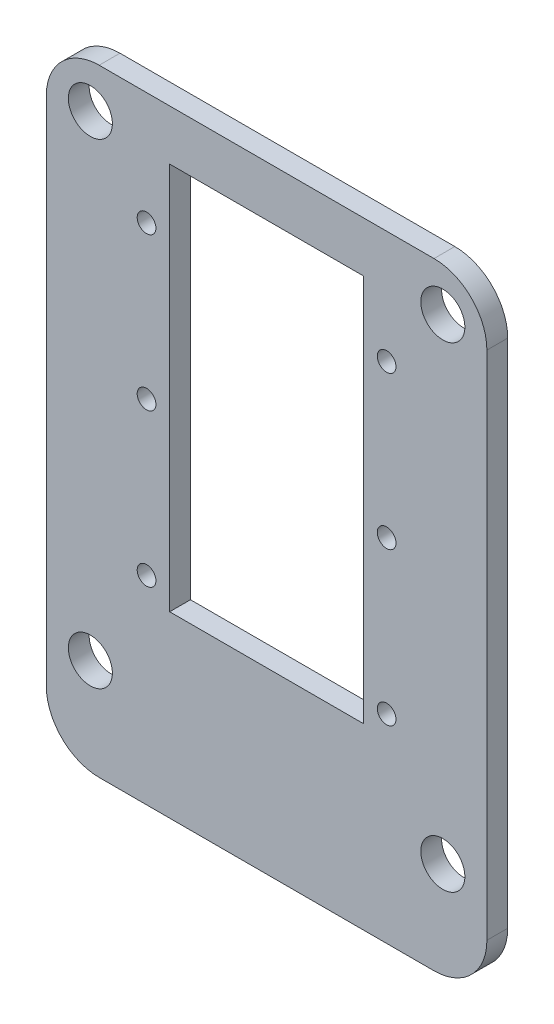
ISO-10303-21;
HEADER;
FILE_DESCRIPTION(('STEP AP214'),'2;1');
FILE_NAME('part.step','',(''),(''),'','','');
FILE_SCHEMA(('AUTOMOTIVE_DESIGN { 1 0 10303 214 1 1 1 1 }'));
ENDSEC;
DATA;
#1=APPLICATION_CONTEXT('core data for automotive mechanical design processes');
#2=APPLICATION_PROTOCOL_DEFINITION('international standard','automotive_design',2000,#1);
#3=PRODUCT_CONTEXT('',#1,'mechanical');
#4=PRODUCT('Part','Part','',(#3));
#5=PRODUCT_RELATED_PRODUCT_CATEGORY('part','',(#4));
#6=PRODUCT_DEFINITION_FORMATION('','',#4);
#7=PRODUCT_DEFINITION_CONTEXT('part definition',#1,'design');
#8=PRODUCT_DEFINITION('design','',#6,#7);
#9=PRODUCT_DEFINITION_SHAPE('','',#8);
#10=(LENGTH_UNIT() NAMED_UNIT(*) SI_UNIT(.MILLI.,.METRE.));
#11=(NAMED_UNIT(*) PLANE_ANGLE_UNIT() SI_UNIT($,.RADIAN.));
#12=(NAMED_UNIT(*) SI_UNIT($,.STERADIAN.) SOLID_ANGLE_UNIT());
#13=UNCERTAINTY_MEASURE_WITH_UNIT(LENGTH_MEASURE(1.E-05),#10,'distance_accuracy_value','');
#14=(GEOMETRIC_REPRESENTATION_CONTEXT(3) GLOBAL_UNCERTAINTY_ASSIGNED_CONTEXT((#13)) GLOBAL_UNIT_ASSIGNED_CONTEXT((#10,
#11,#12)) REPRESENTATION_CONTEXT('',''));
#15=CARTESIAN_POINT('',(0.,0.,0.));
#16=DIRECTION('',(0.,0.,1.));
#17=DIRECTION('',(1.,0.,0.));
#18=AXIS2_PLACEMENT_3D('',#15,#16,#17);
#19=CARTESIAN_POINT('',(-18.1,-22.0973062704397,-3.));
#20=DIRECTION('',(0.,0.,-1.));
#21=DIRECTION('',(-1.,0.,0.));
#22=AXIS2_PLACEMENT_3D('',#19,#20,#21);
#23=PLANE('',#22);
#24=CARTESIAN_POINT('',(25.4,31.8547845003731,-3.));
#25=DIRECTION('',(0.,0.,-1.));
#26=DIRECTION('',(-1.,0.,0.));
#27=AXIS2_PLACEMENT_3D('',#24,#25,#26);
#28=CIRCLE('',#27,3.175);
#29=CARTESIAN_POINT('',(22.225,31.8547845003731,-3.));
#30=VERTEX_POINT('',#29);
#31=EDGE_CURVE('E553',#30,#30,#28,.T.);
#32=ORIENTED_EDGE('',*,*,#31,.F.);
#33=EDGE_LOOP('',(#32));
#34=FACE_BOUND('',#33,.T.);
#35=CARTESIAN_POINT('',(25.3999999999993,-36.7252154996269,-3.));
#36=DIRECTION('',(0.,0.,-1.));
#37=DIRECTION('',(-1.,0.,0.));
#38=AXIS2_PLACEMENT_3D('',#35,#36,#37);
#39=CIRCLE('',#38,3.175);
#40=CARTESIAN_POINT('',(22.2249999999993,-36.7252154996269,-3.));
#41=VERTEX_POINT('',#40);
#42=EDGE_CURVE('E562',#41,#41,#39,.T.);
#43=ORIENTED_EDGE('',*,*,#42,.F.);
#44=EDGE_LOOP('',(#43));
#45=FACE_BOUND('',#44,.T.);
#46=CARTESIAN_POINT('',(-25.4000000000007,-36.7252154996265,-3.));
#47=DIRECTION('',(0.,0.,-1.));
#48=DIRECTION('',(-1.,0.,0.));
#49=AXIS2_PLACEMENT_3D('',#46,#47,#48);
#50=CIRCLE('',#49,3.175);
#51=CARTESIAN_POINT('',(-28.5750000000007,-36.7252154996265,-3.));
#52=VERTEX_POINT('',#51);
#53=EDGE_CURVE('E568',#52,#52,#50,.T.);
#54=ORIENTED_EDGE('',*,*,#53,.F.);
#55=EDGE_LOOP('',(#54));
#56=FACE_BOUND('',#55,.T.);
#57=CARTESIAN_POINT('',(-25.4,31.8547845003735,-3.));
#58=DIRECTION('',(0.,0.,-1.));
#59=DIRECTION('',(-1.,0.,0.));
#60=AXIS2_PLACEMENT_3D('',#57,#58,#59);
#61=CIRCLE('',#60,3.175);
#62=CARTESIAN_POINT('',(-28.575,31.8547845003735,-3.));
#63=VERTEX_POINT('',#62);
#64=EDGE_CURVE('E153',#63,#63,#61,.T.);
#65=ORIENTED_EDGE('',*,*,#64,.F.);
#66=EDGE_LOOP('',(#65));
#67=FACE_BOUND('',#66,.T.);
#68=DIRECTION('',(0.,1.,0.));
#69=VECTOR('',#68,1.);
#70=CARTESIAN_POINT('',(13.97,30.9487845003735,-3.));
#71=LINE('',#70,#69);
#72=CARTESIAN_POINT('',(13.97,-24.9312154996265,-3.));
#73=VERTEX_POINT('',#72);
#74=CARTESIAN_POINT('',(13.97,30.9487845003735,-3.));
#75=VERTEX_POINT('',#74);
#76=EDGE_CURVE('E127',#73,#75,#71,.T.);
#77=ORIENTED_EDGE('',*,*,#76,.T.);
#78=DIRECTION('',(-1.,0.,0.));
#79=VECTOR('',#78,1.);
#80=CARTESIAN_POINT('',(-13.97,30.9487845003735,-3.));
#81=LINE('',#80,#79);
#82=CARTESIAN_POINT('',(-13.97,30.9487845003735,-3.));
#83=VERTEX_POINT('',#82);
#84=EDGE_CURVE('E139',#75,#83,#81,.T.);
#85=ORIENTED_EDGE('',*,*,#84,.T.);
#86=DIRECTION('',(0.,-1.,0.));
#87=VECTOR('',#86,1.);
#88=CARTESIAN_POINT('',(-13.97,30.9487845003735,-3.));
#89=LINE('',#88,#87);
#90=CARTESIAN_POINT('',(-13.97,-24.9312154996265,-3.));
#91=VERTEX_POINT('',#90);
#92=EDGE_CURVE('E143',#83,#91,#89,.T.);
#93=ORIENTED_EDGE('',*,*,#92,.T.);
#94=DIRECTION('',(1.,0.,0.));
#95=VECTOR('',#94,1.);
#96=CARTESIAN_POINT('',(-13.97,-24.9312154996265,-3.));
#97=LINE('',#96,#95);
#98=EDGE_CURVE('E135',#91,#73,#97,.T.);
#99=ORIENTED_EDGE('',*,*,#98,.T.);
#100=EDGE_LOOP('',(#77,#85,#93,#99));
#101=FACE_BOUND('',#100,.T.);
#102=CARTESIAN_POINT('',(-17.3,21.9487845003735,-3.));
#103=DIRECTION('',(0.,0.,-1.));
#104=DIRECTION('',(-1.,0.,0.));
#105=AXIS2_PLACEMENT_3D('',#102,#103,#104);
#106=CIRCLE('',#105,1.35);
#107=CARTESIAN_POINT('',(-18.65,21.9487845003735,-3.));
#108=VERTEX_POINT('',#107);
#109=EDGE_CURVE('E220',#108,#108,#106,.T.);
#110=ORIENTED_EDGE('',*,*,#109,.F.);
#111=EDGE_LOOP('',(#110));
#112=FACE_BOUND('',#111,.T.);
#113=CARTESIAN_POINT('',(-17.3,-0.0512154996265349,-3.));
#114=DIRECTION('',(0.,0.,-1.));
#115=DIRECTION('',(-1.,0.,0.));
#116=AXIS2_PLACEMENT_3D('',#113,#114,#115);
#117=CIRCLE('',#116,1.35);
#118=CARTESIAN_POINT('',(-18.65,-0.0512154996265349,-3.));
#119=VERTEX_POINT('',#118);
#120=EDGE_CURVE('E214',#119,#119,#117,.T.);
#121=ORIENTED_EDGE('',*,*,#120,.F.);
#122=EDGE_LOOP('',(#121));
#123=FACE_BOUND('',#122,.T.);
#124=CARTESIAN_POINT('',(-17.3,-22.0512154996265,-3.));
#125=DIRECTION('',(0.,0.,-1.));
#126=DIRECTION('',(-1.,0.,0.));
#127=AXIS2_PLACEMENT_3D('',#124,#125,#126);
#128=CIRCLE('',#127,1.35);
#129=CARTESIAN_POINT('',(-18.65,-22.0512154996265,-3.));
#130=VERTEX_POINT('',#129);
#131=EDGE_CURVE('E208',#130,#130,#128,.T.);
#132=ORIENTED_EDGE('',*,*,#131,.F.);
#133=EDGE_LOOP('',(#132));
#134=FACE_BOUND('',#133,.T.);
#135=CARTESIAN_POINT('',(17.3,-22.0512154996265,-3.));
#136=DIRECTION('',(0.,0.,-1.));
#137=DIRECTION('',(1.,0.,0.));
#138=AXIS2_PLACEMENT_3D('',#135,#136,#137);
#139=CIRCLE('',#138,1.35);
#140=CARTESIAN_POINT('',(18.65,-22.0512154996265,-3.));
#141=VERTEX_POINT('',#140);
#142=EDGE_CURVE('E202',#141,#141,#139,.T.);
#143=ORIENTED_EDGE('',*,*,#142,.F.);
#144=EDGE_LOOP('',(#143));
#145=FACE_BOUND('',#144,.T.);
#146=CARTESIAN_POINT('',(17.3,-0.0512154996265349,-3.));
#147=DIRECTION('',(0.,0.,-1.));
#148=DIRECTION('',(1.,0.,0.));
#149=AXIS2_PLACEMENT_3D('',#146,#147,#148);
#150=CIRCLE('',#149,1.35);
#151=CARTESIAN_POINT('',(18.65,-0.0512154996265349,-3.));
#152=VERTEX_POINT('',#151);
#153=EDGE_CURVE('E196',#152,#152,#150,.T.);
#154=ORIENTED_EDGE('',*,*,#153,.F.);
#155=EDGE_LOOP('',(#154));
#156=FACE_BOUND('',#155,.T.);
#157=CARTESIAN_POINT('',(17.3,21.9487845003735,-3.));
#158=DIRECTION('',(0.,0.,-1.));
#159=DIRECTION('',(1.,0.,0.));
#160=AXIS2_PLACEMENT_3D('',#157,#158,#159);
#161=CIRCLE('',#160,1.35);
#162=CARTESIAN_POINT('',(18.65,21.9487845003735,-3.));
#163=VERTEX_POINT('',#162);
#164=EDGE_CURVE('E182',#163,#163,#161,.T.);
#165=ORIENTED_EDGE('',*,*,#164,.F.);
#166=EDGE_LOOP('',(#165));
#167=FACE_BOUND('',#166,.T.);
#168=DIRECTION('',(-1.,0.,0.));
#169=VECTOR('',#168,1.);
#170=CARTESIAN_POINT('',(31.75,-50.6952154996265,-3.));
#171=LINE('',#170,#169);
#172=CARTESIAN_POINT('',(24.13,-50.6952154996265,-3.));
#173=VERTEX_POINT('',#172);
#174=CARTESIAN_POINT('',(-24.13,-50.6952154996265,-3.));
#175=VERTEX_POINT('',#174);
#176=EDGE_CURVE('E174',#173,#175,#171,.T.);
#177=ORIENTED_EDGE('',*,*,#176,.T.);
#178=CARTESIAN_POINT('',(-24.13,-43.0752154996265,-3.));
#179=DIRECTION('',(0.,0.,-1.));
#180=DIRECTION('',(-1.,0.,0.));
#181=AXIS2_PLACEMENT_3D('',#178,#179,#180);
#182=CIRCLE('',#181,7.62);
#183=CARTESIAN_POINT('',(-31.75,-43.0752154996265,-3.));
#184=VERTEX_POINT('',#183);
#185=EDGE_CURVE('E239',#175,#184,#182,.T.);
#186=ORIENTED_EDGE('',*,*,#185,.T.);
#187=DIRECTION('',(0.,1.,0.));
#188=VECTOR('',#187,1.);
#189=CARTESIAN_POINT('',(-31.75,38.2047845003735,-3.));
#190=LINE('',#189,#188);
#191=CARTESIAN_POINT('',(-31.75,30.5847845003735,-3.));
#192=VERTEX_POINT('',#191);
#193=EDGE_CURVE('E166',#184,#192,#190,.T.);
#194=ORIENTED_EDGE('',*,*,#193,.T.);
#195=CARTESIAN_POINT('',(-24.13,30.5847845003735,-3.));
#196=DIRECTION('',(0.,0.,-1.));
#197=DIRECTION('',(-1.,0.,0.));
#198=AXIS2_PLACEMENT_3D('',#195,#196,#197);
#199=CIRCLE('',#198,7.62);
#200=CARTESIAN_POINT('',(-24.13,38.2047845003735,-3.));
#201=VERTEX_POINT('',#200);
#202=EDGE_CURVE('E235',#192,#201,#199,.T.);
#203=ORIENTED_EDGE('',*,*,#202,.T.);
#204=DIRECTION('',(1.,0.,0.));
#205=VECTOR('',#204,1.);
#206=CARTESIAN_POINT('',(31.75,38.2047845003735,-3.));
#207=LINE('',#206,#205);
#208=CARTESIAN_POINT('',(24.13,38.2047845003735,-3.));
#209=VERTEX_POINT('',#208);
#210=EDGE_CURVE('E185',#201,#209,#207,.T.);
#211=ORIENTED_EDGE('',*,*,#210,.T.);
#212=CARTESIAN_POINT('',(24.13,30.5847845003735,-3.));
#213=DIRECTION('',(0.,0.,-1.));
#214=DIRECTION('',(-1.,0.,0.));
#215=AXIS2_PLACEMENT_3D('',#212,#213,#214);
#216=CIRCLE('',#215,7.62);
#217=CARTESIAN_POINT('',(31.75,30.5847845003735,-3.));
#218=VERTEX_POINT('',#217);
#219=EDGE_CURVE('E233',#209,#218,#216,.T.);
#220=ORIENTED_EDGE('',*,*,#219,.T.);
#221=DIRECTION('',(0.,-1.,0.));
#222=VECTOR('',#221,1.);
#223=CARTESIAN_POINT('',(31.75,38.2047845003735,-3.));
#224=LINE('',#223,#222);
#225=CARTESIAN_POINT('',(31.75,-43.0752154996265,-3.));
#226=VERTEX_POINT('',#225);
#227=EDGE_CURVE('E188',#218,#226,#224,.T.);
#228=ORIENTED_EDGE('',*,*,#227,.T.);
#229=CARTESIAN_POINT('',(24.13,-43.0752154996265,-3.));
#230=DIRECTION('',(0.,0.,-1.));
#231=DIRECTION('',(-1.,0.,0.));
#232=AXIS2_PLACEMENT_3D('',#229,#230,#231);
#233=CIRCLE('',#232,7.62);
#234=EDGE_CURVE('E237',#226,#173,#233,.T.);
#235=ORIENTED_EDGE('',*,*,#234,.T.);
#236=EDGE_LOOP('',(#177,#186,#194,#203,#211,#220,#228,#235));
#237=FACE_BOUND('',#236,.T.);
#238=ADVANCED_FACE('F34',(#34,#45,#56,#67,#101,#112,#123,#134,#145,#156,#167,#237),#23,.T.);
#239=CARTESIAN_POINT('',(-18.1,-22.0973062704397,0.));
#240=DIRECTION('',(0.,0.,-1.));
#241=DIRECTION('',(-1.,0.,0.));
#242=AXIS2_PLACEMENT_3D('',#239,#240,#241);
#243=PLANE('',#242);
#244=CARTESIAN_POINT('',(25.4,31.8547845003731,0.));
#245=DIRECTION('',(0.,0.,-1.));
#246=DIRECTION('',(-1.,0.,0.));
#247=AXIS2_PLACEMENT_3D('',#244,#245,#246);
#248=CIRCLE('',#247,3.175);
#249=CARTESIAN_POINT('',(22.225,31.8547845003731,0.));
#250=VERTEX_POINT('',#249);
#251=EDGE_CURVE('E551',#250,#250,#248,.T.);
#252=ORIENTED_EDGE('',*,*,#251,.T.);
#253=EDGE_LOOP('',(#252));
#254=FACE_BOUND('',#253,.T.);
#255=CARTESIAN_POINT('',(25.3999999999993,-36.7252154996269,0.));
#256=DIRECTION('',(0.,0.,-1.));
#257=DIRECTION('',(-1.,0.,0.));
#258=AXIS2_PLACEMENT_3D('',#255,#256,#257);
#259=CIRCLE('',#258,3.175);
#260=CARTESIAN_POINT('',(22.2249999999993,-36.7252154996269,0.));
#261=VERTEX_POINT('',#260);
#262=EDGE_CURVE('E557',#261,#261,#259,.T.);
#263=ORIENTED_EDGE('',*,*,#262,.T.);
#264=EDGE_LOOP('',(#263));
#265=FACE_BOUND('',#264,.T.);
#266=CARTESIAN_POINT('',(-25.4000000000007,-36.7252154996265,0.));
#267=DIRECTION('',(0.,0.,-1.));
#268=DIRECTION('',(-1.,0.,0.));
#269=AXIS2_PLACEMENT_3D('',#266,#267,#268);
#270=CIRCLE('',#269,3.175);
#271=CARTESIAN_POINT('',(-28.5750000000007,-36.7252154996265,0.));
#272=VERTEX_POINT('',#271);
#273=EDGE_CURVE('E565',#272,#272,#270,.T.);
#274=ORIENTED_EDGE('',*,*,#273,.T.);
#275=EDGE_LOOP('',(#274));
#276=FACE_BOUND('',#275,.T.);
#277=CARTESIAN_POINT('',(-25.4,31.8547845003735,0.));
#278=DIRECTION('',(0.,0.,-1.));
#279=DIRECTION('',(-1.,0.,0.));
#280=AXIS2_PLACEMENT_3D('',#277,#278,#279);
#281=CIRCLE('',#280,3.175);
#282=CARTESIAN_POINT('',(-28.575,31.8547845003735,0.));
#283=VERTEX_POINT('',#282);
#284=EDGE_CURVE('E160',#283,#283,#281,.T.);
#285=ORIENTED_EDGE('',*,*,#284,.T.);
#286=EDGE_LOOP('',(#285));
#287=FACE_BOUND('',#286,.T.);
#288=DIRECTION('',(-1.,0.,0.));
#289=VECTOR('',#288,1.);
#290=CARTESIAN_POINT('',(-13.97,30.9487845003735,0.));
#291=LINE('',#290,#289);
#292=CARTESIAN_POINT('',(13.97,30.9487845003735,0.));
#293=VERTEX_POINT('',#292);
#294=CARTESIAN_POINT('',(-13.97,30.9487845003735,0.));
#295=VERTEX_POINT('',#294);
#296=EDGE_CURVE('E159',#293,#295,#291,.T.);
#297=ORIENTED_EDGE('',*,*,#296,.F.);
#298=DIRECTION('',(0.,1.,0.));
#299=VECTOR('',#298,1.);
#300=CARTESIAN_POINT('',(13.97,30.9487845003735,0.));
#301=LINE('',#300,#299);
#302=CARTESIAN_POINT('',(13.97,-24.9312154996265,0.));
#303=VERTEX_POINT('',#302);
#304=EDGE_CURVE('E130',#303,#293,#301,.T.);
#305=ORIENTED_EDGE('',*,*,#304,.F.);
#306=DIRECTION('',(1.,0.,0.));
#307=VECTOR('',#306,1.);
#308=CARTESIAN_POINT('',(-13.97,-24.9312154996265,0.));
#309=LINE('',#308,#307);
#310=CARTESIAN_POINT('',(-13.97,-24.9312154996265,0.));
#311=VERTEX_POINT('',#310);
#312=EDGE_CURVE('E147',#311,#303,#309,.T.);
#313=ORIENTED_EDGE('',*,*,#312,.F.);
#314=DIRECTION('',(0.,-1.,0.));
#315=VECTOR('',#314,1.);
#316=CARTESIAN_POINT('',(-13.97,30.9487845003735,0.));
#317=LINE('',#316,#315);
#318=EDGE_CURVE('E150',#295,#311,#317,.T.);
#319=ORIENTED_EDGE('',*,*,#318,.F.);
#320=EDGE_LOOP('',(#297,#305,#313,#319));
#321=FACE_BOUND('',#320,.T.);
#322=CARTESIAN_POINT('',(-17.3,21.9487845003735,0.));
#323=DIRECTION('',(0.,0.,-1.));
#324=DIRECTION('',(-1.,0.,0.));
#325=AXIS2_PLACEMENT_3D('',#322,#323,#324);
#326=CIRCLE('',#325,1.35);
#327=CARTESIAN_POINT('',(-18.65,21.9487845003735,0.));
#328=VERTEX_POINT('',#327);
#329=EDGE_CURVE('E223',#328,#328,#326,.T.);
#330=ORIENTED_EDGE('',*,*,#329,.T.);
#331=EDGE_LOOP('',(#330));
#332=FACE_BOUND('',#331,.T.);
#333=CARTESIAN_POINT('',(-17.3,-0.0512154996265349,0.));
#334=DIRECTION('',(0.,0.,-1.));
#335=DIRECTION('',(-1.,0.,0.));
#336=AXIS2_PLACEMENT_3D('',#333,#334,#335);
#337=CIRCLE('',#336,1.35);
#338=CARTESIAN_POINT('',(-18.65,-0.0512154996265349,0.));
#339=VERTEX_POINT('',#338);
#340=EDGE_CURVE('E217',#339,#339,#337,.T.);
#341=ORIENTED_EDGE('',*,*,#340,.T.);
#342=EDGE_LOOP('',(#341));
#343=FACE_BOUND('',#342,.T.);
#344=CARTESIAN_POINT('',(-17.3,-22.0512154996265,0.));
#345=DIRECTION('',(0.,0.,-1.));
#346=DIRECTION('',(-1.,0.,0.));
#347=AXIS2_PLACEMENT_3D('',#344,#345,#346);
#348=CIRCLE('',#347,1.35);
#349=CARTESIAN_POINT('',(-18.65,-22.0512154996265,0.));
#350=VERTEX_POINT('',#349);
#351=EDGE_CURVE('E211',#350,#350,#348,.T.);
#352=ORIENTED_EDGE('',*,*,#351,.T.);
#353=EDGE_LOOP('',(#352));
#354=FACE_BOUND('',#353,.T.);
#355=CARTESIAN_POINT('',(17.3,-22.0512154996265,0.));
#356=DIRECTION('',(0.,0.,-1.));
#357=DIRECTION('',(1.,0.,0.));
#358=AXIS2_PLACEMENT_3D('',#355,#356,#357);
#359=CIRCLE('',#358,1.35);
#360=CARTESIAN_POINT('',(18.65,-22.0512154996265,0.));
#361=VERTEX_POINT('',#360);
#362=EDGE_CURVE('E205',#361,#361,#359,.T.);
#363=ORIENTED_EDGE('',*,*,#362,.T.);
#364=EDGE_LOOP('',(#363));
#365=FACE_BOUND('',#364,.T.);
#366=CARTESIAN_POINT('',(17.3,-0.0512154996265349,0.));
#367=DIRECTION('',(0.,0.,-1.));
#368=DIRECTION('',(1.,0.,0.));
#369=AXIS2_PLACEMENT_3D('',#366,#367,#368);
#370=CIRCLE('',#369,1.35);
#371=CARTESIAN_POINT('',(18.65,-0.0512154996265349,0.));
#372=VERTEX_POINT('',#371);
#373=EDGE_CURVE('E199',#372,#372,#370,.T.);
#374=ORIENTED_EDGE('',*,*,#373,.T.);
#375=EDGE_LOOP('',(#374));
#376=FACE_BOUND('',#375,.T.);
#377=CARTESIAN_POINT('',(17.3,21.9487845003735,0.));
#378=DIRECTION('',(0.,0.,-1.));
#379=DIRECTION('',(1.,0.,0.));
#380=AXIS2_PLACEMENT_3D('',#377,#378,#379);
#381=CIRCLE('',#380,1.35);
#382=CARTESIAN_POINT('',(18.65,21.9487845003735,0.));
#383=VERTEX_POINT('',#382);
#384=EDGE_CURVE('E193',#383,#383,#381,.T.);
#385=ORIENTED_EDGE('',*,*,#384,.T.);
#386=EDGE_LOOP('',(#385));
#387=FACE_BOUND('',#386,.T.);
#388=DIRECTION('',(0.,1.,0.));
#389=VECTOR('',#388,1.);
#390=CARTESIAN_POINT('',(-31.75,38.2047845003735,0.));
#391=LINE('',#390,#389);
#392=CARTESIAN_POINT('',(-31.75,-43.0752154996265,0.));
#393=VERTEX_POINT('',#392);
#394=CARTESIAN_POINT('',(-31.75,30.5847845003735,0.));
#395=VERTEX_POINT('',#394);
#396=EDGE_CURVE('E170',#393,#395,#391,.T.);
#397=ORIENTED_EDGE('',*,*,#396,.F.);
#398=CARTESIAN_POINT('',(-24.13,-43.0752154996265,0.));
#399=DIRECTION('',(0.,0.,-1.));
#400=DIRECTION('',(-1.,0.,0.));
#401=AXIS2_PLACEMENT_3D('',#398,#399,#400);
#402=CIRCLE('',#401,7.62);
#403=CARTESIAN_POINT('',(-24.13,-50.6952154996265,0.));
#404=VERTEX_POINT('',#403);
#405=EDGE_CURVE('E251',#393,#404,#402,.F.);
#406=ORIENTED_EDGE('',*,*,#405,.T.);
#407=DIRECTION('',(-1.,0.,0.));
#408=VECTOR('',#407,1.);
#409=CARTESIAN_POINT('',(31.75,-50.6952154996265,0.));
#410=LINE('',#409,#408);
#411=CARTESIAN_POINT('',(24.13,-50.6952154996265,0.));
#412=VERTEX_POINT('',#411);
#413=EDGE_CURVE('E179',#412,#404,#410,.T.);
#414=ORIENTED_EDGE('',*,*,#413,.F.);
#415=CARTESIAN_POINT('',(24.13,-43.0752154996265,0.));
#416=DIRECTION('',(0.,0.,-1.));
#417=DIRECTION('',(-1.,0.,0.));
#418=AXIS2_PLACEMENT_3D('',#415,#416,#417);
#419=CIRCLE('',#418,7.62);
#420=CARTESIAN_POINT('',(31.75,-43.0752154996265,0.));
#421=VERTEX_POINT('',#420);
#422=EDGE_CURVE('E249',#412,#421,#419,.F.);
#423=ORIENTED_EDGE('',*,*,#422,.T.);
#424=DIRECTION('',(0.,-1.,0.));
#425=VECTOR('',#424,1.);
#426=CARTESIAN_POINT('',(31.75,38.2047845003735,0.));
#427=LINE('',#426,#425);
#428=CARTESIAN_POINT('',(31.75,30.5847845003735,0.));
#429=VERTEX_POINT('',#428);
#430=EDGE_CURVE('E176',#429,#421,#427,.T.);
#431=ORIENTED_EDGE('',*,*,#430,.F.);
#432=CARTESIAN_POINT('',(24.13,30.5847845003735,0.));
#433=DIRECTION('',(0.,0.,-1.));
#434=DIRECTION('',(-1.,0.,0.));
#435=AXIS2_PLACEMENT_3D('',#432,#433,#434);
#436=CIRCLE('',#435,7.62);
#437=CARTESIAN_POINT('',(24.13,38.2047845003735,0.));
#438=VERTEX_POINT('',#437);
#439=EDGE_CURVE('E49',#429,#438,#436,.F.);
#440=ORIENTED_EDGE('',*,*,#439,.T.);
#441=DIRECTION('',(1.,0.,0.));
#442=VECTOR('',#441,1.);
#443=CARTESIAN_POINT('',(31.75,38.2047845003735,0.));
#444=LINE('',#443,#442);
#445=CARTESIAN_POINT('',(-24.13,38.2047845003735,0.));
#446=VERTEX_POINT('',#445);
#447=EDGE_CURVE('E173',#446,#438,#444,.T.);
#448=ORIENTED_EDGE('',*,*,#447,.F.);
#449=CARTESIAN_POINT('',(-24.13,30.5847845003735,0.));
#450=DIRECTION('',(0.,0.,-1.));
#451=DIRECTION('',(-1.,0.,0.));
#452=AXIS2_PLACEMENT_3D('',#449,#450,#451);
#453=CIRCLE('',#452,7.62);
#454=EDGE_CURVE('E247',#446,#395,#453,.F.);
#455=ORIENTED_EDGE('',*,*,#454,.T.);
#456=EDGE_LOOP('',(#397,#406,#414,#423,#431,#440,#448,#455));
#457=FACE_BOUND('',#456,.T.);
#458=ADVANCED_FACE('F273',(#254,#265,#276,#287,#321,#332,#343,#354,#365,#376,#387,#457),#243,.F.);
#459=CARTESIAN_POINT('',(-17.3,21.9487845003735,0.));
#460=DIRECTION('',(0.,0.,-1.));
#461=DIRECTION('',(-1.,0.,0.));
#462=AXIS2_PLACEMENT_3D('',#459,#460,#461);
#463=CYLINDRICAL_SURFACE('',#462,1.35);
#464=ORIENTED_EDGE('',*,*,#329,.F.);
#465=EDGE_LOOP('',(#464));
#466=FACE_BOUND('',#465,.T.);
#467=ORIENTED_EDGE('',*,*,#109,.T.);
#468=EDGE_LOOP('',(#467));
#469=FACE_BOUND('',#468,.T.);
#470=ADVANCED_FACE('F299',(#466,#469),#463,.F.);
#471=CARTESIAN_POINT('',(-17.3,-0.0512154996265349,0.));
#472=DIRECTION('',(0.,0.,-1.));
#473=DIRECTION('',(-1.,0.,0.));
#474=AXIS2_PLACEMENT_3D('',#471,#472,#473);
#475=CYLINDRICAL_SURFACE('',#474,1.35);
#476=ORIENTED_EDGE('',*,*,#340,.F.);
#477=EDGE_LOOP('',(#476));
#478=FACE_BOUND('',#477,.T.);
#479=ORIENTED_EDGE('',*,*,#120,.T.);
#480=EDGE_LOOP('',(#479));
#481=FACE_BOUND('',#480,.T.);
#482=ADVANCED_FACE('F478',(#478,#481),#475,.F.);
#483=CARTESIAN_POINT('',(-17.3,-22.0512154996265,0.));
#484=DIRECTION('',(0.,0.,-1.));
#485=DIRECTION('',(-1.,0.,0.));
#486=AXIS2_PLACEMENT_3D('',#483,#484,#485);
#487=CYLINDRICAL_SURFACE('',#486,1.35);
#488=ORIENTED_EDGE('',*,*,#351,.F.);
#489=EDGE_LOOP('',(#488));
#490=FACE_BOUND('',#489,.T.);
#491=ORIENTED_EDGE('',*,*,#131,.T.);
#492=EDGE_LOOP('',(#491));
#493=FACE_BOUND('',#492,.T.);
#494=ADVANCED_FACE('F469',(#490,#493),#487,.F.);
#495=CARTESIAN_POINT('',(17.3,-22.0512154996265,0.));
#496=DIRECTION('',(0.,0.,-1.));
#497=DIRECTION('',(-1.,0.,0.));
#498=AXIS2_PLACEMENT_3D('',#495,#496,#497);
#499=CYLINDRICAL_SURFACE('',#498,1.35);
#500=ORIENTED_EDGE('',*,*,#362,.F.);
#501=EDGE_LOOP('',(#500));
#502=FACE_BOUND('',#501,.T.);
#503=ORIENTED_EDGE('',*,*,#142,.T.);
#504=EDGE_LOOP('',(#503));
#505=FACE_BOUND('',#504,.T.);
#506=ADVANCED_FACE('F460',(#502,#505),#499,.F.);
#507=CARTESIAN_POINT('',(17.3,-0.0512154996265349,0.));
#508=DIRECTION('',(0.,0.,-1.));
#509=DIRECTION('',(-1.,0.,0.));
#510=AXIS2_PLACEMENT_3D('',#507,#508,#509);
#511=CYLINDRICAL_SURFACE('',#510,1.35);
#512=ORIENTED_EDGE('',*,*,#373,.F.);
#513=EDGE_LOOP('',(#512));
#514=FACE_BOUND('',#513,.T.);
#515=ORIENTED_EDGE('',*,*,#153,.T.);
#516=EDGE_LOOP('',(#515));
#517=FACE_BOUND('',#516,.T.);
#518=ADVANCED_FACE('F451',(#514,#517),#511,.F.);
#519=CARTESIAN_POINT('',(17.3,21.9487845003735,0.));
#520=DIRECTION('',(0.,0.,-1.));
#521=DIRECTION('',(-1.,0.,0.));
#522=AXIS2_PLACEMENT_3D('',#519,#520,#521);
#523=CYLINDRICAL_SURFACE('',#522,1.35);
#524=ORIENTED_EDGE('',*,*,#384,.F.);
#525=EDGE_LOOP('',(#524));
#526=FACE_BOUND('',#525,.T.);
#527=ORIENTED_EDGE('',*,*,#164,.T.);
#528=EDGE_LOOP('',(#527));
#529=FACE_BOUND('',#528,.T.);
#530=ADVANCED_FACE('F428',(#526,#529),#523,.F.);
#531=CARTESIAN_POINT('',(-31.75,38.2047845003735,0.));
#532=DIRECTION('',(-1.,0.,0.));
#533=DIRECTION('',(0.,-1.,0.));
#534=AXIS2_PLACEMENT_3D('',#531,#532,#533);
#535=PLANE('',#534);
#536=ORIENTED_EDGE('',*,*,#193,.F.);
#537=DIRECTION('',(0.,0.,-1.));
#538=VECTOR('',#537,1.);
#539=CARTESIAN_POINT('',(-31.75,-43.0752154996265,0.));
#540=LINE('',#539,#538);
#541=EDGE_CURVE('E244',#184,#393,#540,.F.);
#542=ORIENTED_EDGE('',*,*,#541,.T.);
#543=ORIENTED_EDGE('',*,*,#396,.T.);
#544=DIRECTION('',(0.,0.,-1.));
#545=VECTOR('',#544,1.);
#546=CARTESIAN_POINT('',(-31.75,30.5847845003735,0.));
#547=LINE('',#546,#545);
#548=EDGE_CURVE('E241',#395,#192,#547,.T.);
#549=ORIENTED_EDGE('',*,*,#548,.T.);
#550=EDGE_LOOP('',(#536,#542,#543,#549));
#551=FACE_BOUND('',#550,.T.);
#552=ADVANCED_FACE('F269',(#551),#535,.T.);
#553=CARTESIAN_POINT('',(31.75,-50.6952154996265,0.));
#554=DIRECTION('',(0.,-1.,0.));
#555=DIRECTION('',(1.,0.,0.));
#556=AXIS2_PLACEMENT_3D('',#553,#554,#555);
#557=PLANE('',#556);
#558=ORIENTED_EDGE('',*,*,#413,.T.);
#559=DIRECTION('',(0.,0.,-1.));
#560=VECTOR('',#559,1.);
#561=CARTESIAN_POINT('',(-24.13,-50.6952154996265,0.));
#562=LINE('',#561,#560);
#563=EDGE_CURVE('E230',#404,#175,#562,.T.);
#564=ORIENTED_EDGE('',*,*,#563,.T.);
#565=ORIENTED_EDGE('',*,*,#176,.F.);
#566=DIRECTION('',(0.,0.,-1.));
#567=VECTOR('',#566,1.);
#568=CARTESIAN_POINT('',(24.13,-50.6952154996265,0.));
#569=LINE('',#568,#567);
#570=EDGE_CURVE('E226',#173,#412,#569,.F.);
#571=ORIENTED_EDGE('',*,*,#570,.T.);
#572=EDGE_LOOP('',(#558,#564,#565,#571));
#573=FACE_BOUND('',#572,.T.);
#574=ADVANCED_FACE('F280',(#573),#557,.T.);
#575=CARTESIAN_POINT('',(31.75,38.2047845003735,0.));
#576=DIRECTION('',(1.,0.,0.));
#577=DIRECTION('',(0.,1.,0.));
#578=AXIS2_PLACEMENT_3D('',#575,#576,#577);
#579=PLANE('',#578);
#580=ORIENTED_EDGE('',*,*,#430,.T.);
#581=DIRECTION('',(0.,0.,-1.));
#582=VECTOR('',#581,1.);
#583=CARTESIAN_POINT('',(31.75,-43.0752154996265,0.));
#584=LINE('',#583,#582);
#585=EDGE_CURVE('E255',#421,#226,#584,.T.);
#586=ORIENTED_EDGE('',*,*,#585,.T.);
#587=ORIENTED_EDGE('',*,*,#227,.F.);
#588=DIRECTION('',(0.,0.,-1.));
#589=VECTOR('',#588,1.);
#590=CARTESIAN_POINT('',(31.75,30.5847845003735,0.));
#591=LINE('',#590,#589);
#592=EDGE_CURVE('E253',#218,#429,#591,.F.);
#593=ORIENTED_EDGE('',*,*,#592,.T.);
#594=EDGE_LOOP('',(#580,#586,#587,#593));
#595=FACE_BOUND('',#594,.T.);
#596=ADVANCED_FACE('F287',(#595),#579,.T.);
#597=CARTESIAN_POINT('',(31.75,38.2047845003735,0.));
#598=DIRECTION('',(0.,1.,0.));
#599=DIRECTION('',(0.,0.,1.));
#600=AXIS2_PLACEMENT_3D('',#597,#598,#599);
#601=PLANE('',#600);
#602=ORIENTED_EDGE('',*,*,#210,.F.);
#603=DIRECTION('',(0.,0.,-1.));
#604=VECTOR('',#603,1.);
#605=CARTESIAN_POINT('',(-24.13,38.2047845003735,0.));
#606=LINE('',#605,#604);
#607=EDGE_CURVE('E11',#201,#446,#606,.F.);
#608=ORIENTED_EDGE('',*,*,#607,.T.);
#609=ORIENTED_EDGE('',*,*,#447,.T.);
#610=DIRECTION('',(0.,0.,-1.));
#611=VECTOR('',#610,1.);
#612=CARTESIAN_POINT('',(24.13,38.2047845003735,0.));
#613=LINE('',#612,#611);
#614=EDGE_CURVE('E42',#438,#209,#613,.T.);
#615=ORIENTED_EDGE('',*,*,#614,.T.);
#616=EDGE_LOOP('',(#602,#608,#609,#615));
#617=FACE_BOUND('',#616,.T.);
#618=ADVANCED_FACE('F259',(#617),#601,.T.);
#619=CARTESIAN_POINT('',(13.97,30.9487845003735,-3.));
#620=DIRECTION('',(1.,0.,0.));
#621=DIRECTION('',(0.,1.,0.));
#622=AXIS2_PLACEMENT_3D('',#619,#620,#621);
#623=PLANE('',#622);
#624=ORIENTED_EDGE('',*,*,#304,.T.);
#625=DIRECTION('',(0.,0.,1.));
#626=VECTOR('',#625,1.);
#627=CARTESIAN_POINT('',(13.97,30.9487845003735,-3.));
#628=LINE('',#627,#626);
#629=EDGE_CURVE('E123',#75,#293,#628,.T.);
#630=ORIENTED_EDGE('',*,*,#629,.F.);
#631=ORIENTED_EDGE('',*,*,#76,.F.);
#632=DIRECTION('',(0.,0.,1.));
#633=VECTOR('',#632,1.);
#634=CARTESIAN_POINT('',(13.97,-24.9312154996265,-3.));
#635=LINE('',#634,#633);
#636=EDGE_CURVE('E164',#73,#303,#635,.T.);
#637=ORIENTED_EDGE('',*,*,#636,.T.);
#638=EDGE_LOOP('',(#624,#630,#631,#637));
#639=FACE_BOUND('',#638,.T.);
#640=ADVANCED_FACE('F125',(#639),#623,.F.);
#641=CARTESIAN_POINT('',(-13.97,-24.9312154996265,-3.));
#642=DIRECTION('',(0.,-1.,0.));
#643=DIRECTION('',(0.,0.,-1.));
#644=AXIS2_PLACEMENT_3D('',#641,#642,#643);
#645=PLANE('',#644);
#646=ORIENTED_EDGE('',*,*,#312,.T.);
#647=ORIENTED_EDGE('',*,*,#636,.F.);
#648=ORIENTED_EDGE('',*,*,#98,.F.);
#649=DIRECTION('',(0.,0.,1.));
#650=VECTOR('',#649,1.);
#651=CARTESIAN_POINT('',(-13.97,-24.9312154996265,-3.));
#652=LINE('',#651,#650);
#653=EDGE_CURVE('E167',#91,#311,#652,.T.);
#654=ORIENTED_EDGE('',*,*,#653,.T.);
#655=EDGE_LOOP('',(#646,#647,#648,#654));
#656=FACE_BOUND('',#655,.T.);
#657=ADVANCED_FACE('F383',(#656),#645,.F.);
#658=CARTESIAN_POINT('',(-13.97,30.9487845003735,-3.));
#659=DIRECTION('',(-1.,0.,0.));
#660=DIRECTION('',(0.,-1.,0.));
#661=AXIS2_PLACEMENT_3D('',#658,#659,#660);
#662=PLANE('',#661);
#663=ORIENTED_EDGE('',*,*,#318,.T.);
#664=ORIENTED_EDGE('',*,*,#653,.F.);
#665=ORIENTED_EDGE('',*,*,#92,.F.);
#666=DIRECTION('',(0.,0.,1.));
#667=VECTOR('',#666,1.);
#668=CARTESIAN_POINT('',(-13.97,30.9487845003735,-3.));
#669=LINE('',#668,#667);
#670=EDGE_CURVE('E134',#83,#295,#669,.T.);
#671=ORIENTED_EDGE('',*,*,#670,.T.);
#672=EDGE_LOOP('',(#663,#664,#665,#671));
#673=FACE_BOUND('',#672,.T.);
#674=ADVANCED_FACE('F375',(#673),#662,.F.);
#675=CARTESIAN_POINT('',(-13.97,30.9487845003735,-3.));
#676=DIRECTION('',(0.,1.,0.));
#677=DIRECTION('',(0.,0.,1.));
#678=AXIS2_PLACEMENT_3D('',#675,#676,#677);
#679=PLANE('',#678);
#680=ORIENTED_EDGE('',*,*,#296,.T.);
#681=ORIENTED_EDGE('',*,*,#670,.F.);
#682=ORIENTED_EDGE('',*,*,#84,.F.);
#683=ORIENTED_EDGE('',*,*,#629,.T.);
#684=EDGE_LOOP('',(#680,#681,#682,#683));
#685=FACE_BOUND('',#684,.T.);
#686=ADVANCED_FACE('F140',(#685),#679,.F.);
#687=CARTESIAN_POINT('',(-25.4,31.8547845003735,0.));
#688=DIRECTION('',(0.,0.,-1.));
#689=DIRECTION('',(-1.,0.,0.));
#690=AXIS2_PLACEMENT_3D('',#687,#688,#689);
#691=CYLINDRICAL_SURFACE('',#690,3.175);
#692=ORIENTED_EDGE('',*,*,#284,.F.);
#693=EDGE_LOOP('',(#692));
#694=FACE_BOUND('',#693,.T.);
#695=ORIENTED_EDGE('',*,*,#64,.T.);
#696=EDGE_LOOP('',(#695));
#697=FACE_BOUND('',#696,.T.);
#698=ADVANCED_FACE('F358',(#694,#697),#691,.F.);
#699=CARTESIAN_POINT('',(-25.4000000000007,-36.7252154996265,0.));
#700=DIRECTION('',(0.,0.,-1.));
#701=DIRECTION('',(-1.,0.,0.));
#702=AXIS2_PLACEMENT_3D('',#699,#700,#701);
#703=CYLINDRICAL_SURFACE('',#702,3.175);
#704=ORIENTED_EDGE('',*,*,#273,.F.);
#705=EDGE_LOOP('',(#704));
#706=FACE_BOUND('',#705,.T.);
#707=ORIENTED_EDGE('',*,*,#53,.T.);
#708=EDGE_LOOP('',(#707));
#709=FACE_BOUND('',#708,.T.);
#710=ADVANCED_FACE('F349',(#706,#709),#703,.F.);
#711=CARTESIAN_POINT('',(25.3999999999993,-36.7252154996269,0.));
#712=DIRECTION('',(0.,0.,-1.));
#713=DIRECTION('',(-1.,0.,0.));
#714=AXIS2_PLACEMENT_3D('',#711,#712,#713);
#715=CYLINDRICAL_SURFACE('',#714,3.175);
#716=ORIENTED_EDGE('',*,*,#262,.F.);
#717=EDGE_LOOP('',(#716));
#718=FACE_BOUND('',#717,.T.);
#719=ORIENTED_EDGE('',*,*,#42,.T.);
#720=EDGE_LOOP('',(#719));
#721=FACE_BOUND('',#720,.T.);
#722=ADVANCED_FACE('F340',(#718,#721),#715,.F.);
#723=CARTESIAN_POINT('',(25.4,31.8547845003731,0.));
#724=DIRECTION('',(0.,0.,-1.));
#725=DIRECTION('',(-1.,0.,0.));
#726=AXIS2_PLACEMENT_3D('',#723,#724,#725);
#727=CYLINDRICAL_SURFACE('',#726,3.175);
#728=ORIENTED_EDGE('',*,*,#251,.F.);
#729=EDGE_LOOP('',(#728));
#730=FACE_BOUND('',#729,.T.);
#731=ORIENTED_EDGE('',*,*,#31,.T.);
#732=EDGE_LOOP('',(#731));
#733=FACE_BOUND('',#732,.T.);
#734=ADVANCED_FACE('F309',(#730,#733),#727,.F.);
#735=CARTESIAN_POINT('',(-24.13,-43.0752154996265,0.));
#736=DIRECTION('',(0.,0.,-1.));
#737=DIRECTION('',(-1.,0.,0.));
#738=AXIS2_PLACEMENT_3D('',#735,#736,#737);
#739=CYLINDRICAL_SURFACE('',#738,7.62);
#740=ORIENTED_EDGE('',*,*,#405,.F.);
#741=ORIENTED_EDGE('',*,*,#541,.F.);
#742=ORIENTED_EDGE('',*,*,#185,.F.);
#743=ORIENTED_EDGE('',*,*,#563,.F.);
#744=EDGE_LOOP('',(#740,#741,#742,#743));
#745=FACE_BOUND('',#744,.T.);
#746=ADVANCED_FACE('F277',(#745),#739,.T.);
#747=CARTESIAN_POINT('',(24.13,-43.0752154996265,0.));
#748=DIRECTION('',(0.,0.,-1.));
#749=DIRECTION('',(-1.,0.,0.));
#750=AXIS2_PLACEMENT_3D('',#747,#748,#749);
#751=CYLINDRICAL_SURFACE('',#750,7.62);
#752=ORIENTED_EDGE('',*,*,#422,.F.);
#753=ORIENTED_EDGE('',*,*,#570,.F.);
#754=ORIENTED_EDGE('',*,*,#234,.F.);
#755=ORIENTED_EDGE('',*,*,#585,.F.);
#756=EDGE_LOOP('',(#752,#753,#754,#755));
#757=FACE_BOUND('',#756,.T.);
#758=ADVANCED_FACE('F285',(#757),#751,.T.);
#759=CARTESIAN_POINT('',(-24.13,30.5847845003735,0.));
#760=DIRECTION('',(0.,0.,-1.));
#761=DIRECTION('',(-1.,0.,0.));
#762=AXIS2_PLACEMENT_3D('',#759,#760,#761);
#763=CYLINDRICAL_SURFACE('',#762,7.62);
#764=ORIENTED_EDGE('',*,*,#454,.F.);
#765=ORIENTED_EDGE('',*,*,#607,.F.);
#766=ORIENTED_EDGE('',*,*,#202,.F.);
#767=ORIENTED_EDGE('',*,*,#548,.F.);
#768=EDGE_LOOP('',(#764,#765,#766,#767));
#769=FACE_BOUND('',#768,.T.);
#770=ADVANCED_FACE('F267',(#769),#763,.T.);
#771=CARTESIAN_POINT('',(24.13,30.5847845003735,0.));
#772=DIRECTION('',(0.,0.,-1.));
#773=DIRECTION('',(-1.,0.,0.));
#774=AXIS2_PLACEMENT_3D('',#771,#772,#773);
#775=CYLINDRICAL_SURFACE('',#774,7.62);
#776=ORIENTED_EDGE('',*,*,#439,.F.);
#777=ORIENTED_EDGE('',*,*,#592,.F.);
#778=ORIENTED_EDGE('',*,*,#219,.F.);
#779=ORIENTED_EDGE('',*,*,#614,.F.);
#780=EDGE_LOOP('',(#776,#777,#778,#779));
#781=FACE_BOUND('',#780,.T.);
#782=ADVANCED_FACE('F36',(#781),#775,.T.);
#783=CLOSED_SHELL('',(#238,#458,#470,#482,#494,#506,#518,#530,#552,#574,#596,#618,#640,#657,
#674,#686,#698,#710,#722,#734,#746,#758,#770,#782));
#784=MANIFOLD_SOLID_BREP('B2',#783);
#785=ADVANCED_BREP_SHAPE_REPRESENTATION('',(#18,#784),#14);
#786=SHAPE_DEFINITION_REPRESENTATION(#9,#785);
ENDSEC;
END-ISO-10303-21;
